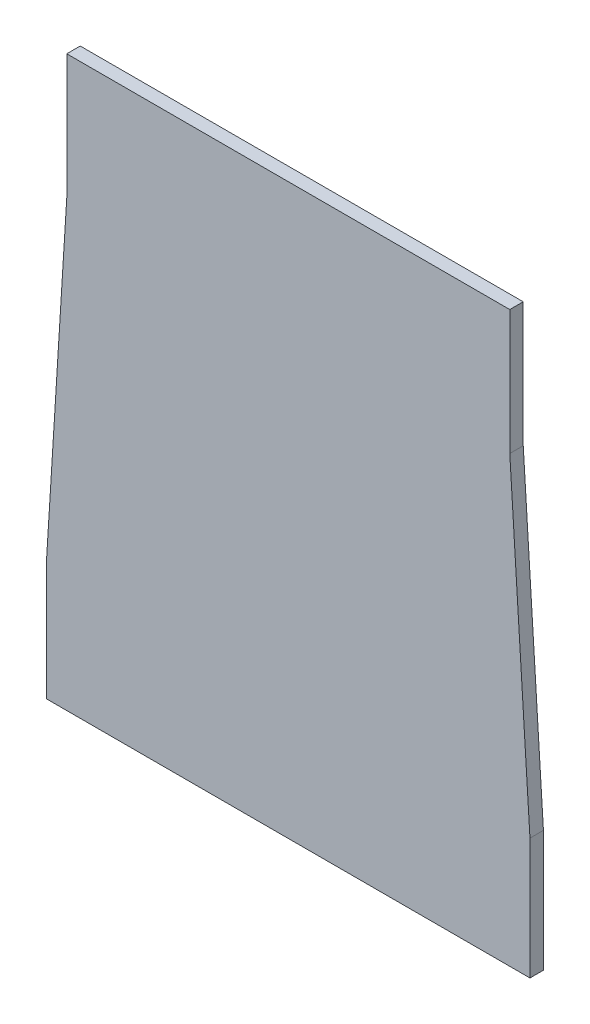
ISO-10303-21;
HEADER;
FILE_DESCRIPTION(('STEP AP214'),'2;1');
FILE_NAME('part.step','',(''),(''),'','','');
FILE_SCHEMA(('AUTOMOTIVE_DESIGN { 1 0 10303 214 1 1 1 1 }'));
ENDSEC;
DATA;
#1=APPLICATION_CONTEXT('core data for automotive mechanical design processes');
#2=APPLICATION_PROTOCOL_DEFINITION('international standard','automotive_design',2000,#1);
#3=PRODUCT_CONTEXT('',#1,'mechanical');
#4=PRODUCT('Part','Part','',(#3));
#5=PRODUCT_RELATED_PRODUCT_CATEGORY('part','',(#4));
#6=PRODUCT_DEFINITION_FORMATION('','',#4);
#7=PRODUCT_DEFINITION_CONTEXT('part definition',#1,'design');
#8=PRODUCT_DEFINITION('design','',#6,#7);
#9=PRODUCT_DEFINITION_SHAPE('','',#8);
#10=(LENGTH_UNIT() NAMED_UNIT(*) SI_UNIT(.MILLI.,.METRE.));
#11=(NAMED_UNIT(*) PLANE_ANGLE_UNIT() SI_UNIT($,.RADIAN.));
#12=(NAMED_UNIT(*) SI_UNIT($,.STERADIAN.) SOLID_ANGLE_UNIT());
#13=UNCERTAINTY_MEASURE_WITH_UNIT(LENGTH_MEASURE(1.E-05),#10,'distance_accuracy_value','');
#14=(GEOMETRIC_REPRESENTATION_CONTEXT(3) GLOBAL_UNCERTAINTY_ASSIGNED_CONTEXT((#13)) GLOBAL_UNIT_ASSIGNED_CONTEXT((#10,
#11,#12)) REPRESENTATION_CONTEXT('',''));
#15=CARTESIAN_POINT('',(0.,0.,0.));
#16=DIRECTION('',(0.,0.,1.));
#17=DIRECTION('',(1.,0.,0.));
#18=AXIS2_PLACEMENT_3D('',#15,#16,#17);
#19=CARTESIAN_POINT('',(209.03946,-5469.17953057513,12.7));
#20=DIRECTION('',(-1.,0.,0.));
#21=DIRECTION('',(0.,0.,1.));
#22=AXIS2_PLACEMENT_3D('',#19,#20,#21);
#23=PLANE('',#22);
#24=DIRECTION('',(0.,1.,0.));
#25=VECTOR('',#24,1.);
#26=CARTESIAN_POINT('',(209.03946,-5469.17953057513,12.7));
#27=LINE('',#26,#25);
#28=CARTESIAN_POINT('',(209.03946,-5158.00577036498,12.7));
#29=VERTEX_POINT('',#28);
#30=CARTESIAN_POINT('',(209.03946,-5040.33140744906,12.7));
#31=VERTEX_POINT('',#30);
#32=EDGE_CURVE('E145',#29,#31,#27,.T.);
#33=ORIENTED_EDGE('',*,*,#32,.F.);
#34=DIRECTION('',(0.,0.,-1.));
#35=VECTOR('',#34,1.);
#36=CARTESIAN_POINT('',(209.03946,-5158.00577036498,12.7));
#37=LINE('',#36,#35);
#38=CARTESIAN_POINT('',(209.03946,-5158.00577036498,0.));
#39=VERTEX_POINT('',#38);
#40=EDGE_CURVE('E151',#29,#39,#37,.T.);
#41=ORIENTED_EDGE('',*,*,#40,.T.);
#42=DIRECTION('',(0.,1.,0.));
#43=VECTOR('',#42,1.);
#44=CARTESIAN_POINT('',(209.03946,-5469.17953057513,0.));
#45=LINE('',#44,#43);
#46=CARTESIAN_POINT('',(209.03946,-5040.33140744906,0.));
#47=VERTEX_POINT('',#46);
#48=EDGE_CURVE('E115',#39,#47,#45,.T.);
#49=ORIENTED_EDGE('',*,*,#48,.T.);
#50=DIRECTION('',(0.,0.,-1.));
#51=VECTOR('',#50,1.);
#52=CARTESIAN_POINT('',(209.03946,-5040.33140744906,12.7));
#53=LINE('',#52,#51);
#54=EDGE_CURVE('E139',#31,#47,#53,.T.);
#55=ORIENTED_EDGE('',*,*,#54,.F.);
#56=EDGE_LOOP('',(#33,#41,#49,#55));
#57=FACE_BOUND('',#56,.T.);
#58=ADVANCED_FACE('F35',(#57),#23,.F.);
#59=CARTESIAN_POINT('',(-209.03946,-5469.17953057513,12.7));
#60=DIRECTION('',(1.,0.,0.));
#61=DIRECTION('',(0.,0.,-1.));
#62=AXIS2_PLACEMENT_3D('',#59,#60,#61);
#63=PLANE('',#62);
#64=DIRECTION('',(0.,-1.,0.));
#65=VECTOR('',#64,1.);
#66=CARTESIAN_POINT('',(-209.03946,-5469.17953057513,0.));
#67=LINE('',#66,#65);
#68=CARTESIAN_POINT('',(-209.03946,-5040.33140744906,0.));
#69=VERTEX_POINT('',#68);
#70=CARTESIAN_POINT('',(-209.03946,-5158.00577036498,0.));
#71=VERTEX_POINT('',#70);
#72=EDGE_CURVE('E148',#69,#71,#67,.T.);
#73=ORIENTED_EDGE('',*,*,#72,.T.);
#74=DIRECTION('',(0.,0.,1.));
#75=VECTOR('',#74,1.);
#76=CARTESIAN_POINT('',(-209.03946,-5158.00577036498,12.7));
#77=LINE('',#76,#75);
#78=CARTESIAN_POINT('',(-209.03946,-5158.00577036498,12.7));
#79=VERTEX_POINT('',#78);
#80=EDGE_CURVE('E157',#71,#79,#77,.T.);
#81=ORIENTED_EDGE('',*,*,#80,.T.);
#82=DIRECTION('',(0.,-1.,0.));
#83=VECTOR('',#82,1.);
#84=CARTESIAN_POINT('',(-209.03946,-5469.17953057513,12.7));
#85=LINE('',#84,#83);
#86=CARTESIAN_POINT('',(-209.03946,-5040.33140744906,12.7));
#87=VERTEX_POINT('',#86);
#88=EDGE_CURVE('E147',#87,#79,#85,.T.);
#89=ORIENTED_EDGE('',*,*,#88,.F.);
#90=DIRECTION('',(0.,0.,-1.));
#91=VECTOR('',#90,1.);
#92=CARTESIAN_POINT('',(-209.03946,-5040.33140744906,12.7));
#93=LINE('',#92,#91);
#94=EDGE_CURVE('E136',#87,#69,#93,.T.);
#95=ORIENTED_EDGE('',*,*,#94,.T.);
#96=EDGE_LOOP('',(#73,#81,#89,#95));
#97=FACE_BOUND('',#96,.T.);
#98=ADVANCED_FACE('F170',(#97),#63,.F.);
#99=CARTESIAN_POINT('',(0.,0.,12.7));
#100=DIRECTION('',(0.,0.,1.));
#101=DIRECTION('',(1.,0.,0.));
#102=AXIS2_PLACEMENT_3D('',#99,#100,#101);
#103=PLANE('',#102);
#104=DIRECTION('',(-1.,0.,0.));
#105=VECTOR('',#104,1.);
#106=CARTESIAN_POINT('',(209.03946,-5577.12953057513,12.7));
#107=LINE('',#106,#105);
#108=CARTESIAN_POINT('',(228.088766336441,-5577.12953057513,12.7));
#109=VERTEX_POINT('',#108);
#110=CARTESIAN_POINT('',(-228.088766336441,-5577.12953057513,12.7));
#111=VERTEX_POINT('',#110);
#112=EDGE_CURVE('E106',#109,#111,#107,.T.);
#113=ORIENTED_EDGE('',*,*,#112,.F.);
#114=DIRECTION('',(0.,-1.,0.));
#115=VECTOR('',#114,1.);
#116=CARTESIAN_POINT('',(228.088766336441,-5462.80577036498,12.7));
#117=LINE('',#116,#115);
#118=CARTESIAN_POINT('',(228.088766336441,-5462.79467174804,12.7));
#119=VERTEX_POINT('',#118);
#120=EDGE_CURVE('E110',#119,#109,#117,.T.);
#121=ORIENTED_EDGE('',*,*,#120,.F.);
#122=DIRECTION('',(-0.0623782861551805,0.998052578482889,0.));
#123=VECTOR('',#122,1.);
#124=CARTESIAN_POINT('',(209.03946,-5158.00577036498,12.7));
#125=LINE('',#124,#123);
#126=EDGE_CURVE('E162',#119,#29,#125,.T.);
#127=ORIENTED_EDGE('',*,*,#126,.T.);
#128=ORIENTED_EDGE('',*,*,#32,.T.);
#129=DIRECTION('',(1.,0.,0.));
#130=VECTOR('',#129,1.);
#131=CARTESIAN_POINT('',(-209.03946,-5040.33140744906,12.7));
#132=LINE('',#131,#130);
#133=EDGE_CURVE('E133',#87,#31,#132,.T.);
#134=ORIENTED_EDGE('',*,*,#133,.F.);
#135=ORIENTED_EDGE('',*,*,#88,.T.);
#136=DIRECTION('',(-0.0623782861551805,-0.998052578482889,0.));
#137=VECTOR('',#136,1.);
#138=CARTESIAN_POINT('',(-209.03946,-5158.00577036498,12.7));
#139=LINE('',#138,#137);
#140=CARTESIAN_POINT('',(-228.088766336441,-5462.79467174804,12.7));
#141=VERTEX_POINT('',#140);
#142=EDGE_CURVE('E72',#79,#141,#139,.T.);
#143=ORIENTED_EDGE('',*,*,#142,.T.);
#144=DIRECTION('',(0.,1.,0.));
#145=VECTOR('',#144,1.);
#146=CARTESIAN_POINT('',(-228.088766336441,-5462.80577036498,12.7));
#147=LINE('',#146,#145);
#148=EDGE_CURVE('E111',#111,#141,#147,.T.);
#149=ORIENTED_EDGE('',*,*,#148,.F.);
#150=EDGE_LOOP('',(#113,#121,#127,#128,#134,#135,#143,#149));
#151=FACE_BOUND('',#150,.T.);
#152=ADVANCED_FACE('F108',(#151),#103,.T.);
#153=CARTESIAN_POINT('',(0.,0.,0.));
#154=DIRECTION('',(0.,0.,1.));
#155=DIRECTION('',(1.,0.,0.));
#156=AXIS2_PLACEMENT_3D('',#153,#154,#155);
#157=PLANE('',#156);
#158=ORIENTED_EDGE('',*,*,#48,.F.);
#159=DIRECTION('',(0.0623782861551805,-0.998052578482889,0.));
#160=VECTOR('',#159,1.);
#161=CARTESIAN_POINT('',(-112.894904925446,-7.0559315578404,0.));
#162=LINE('',#161,#160);
#163=CARTESIAN_POINT('',(228.088766336441,-5462.79467174804,0.));
#164=VERTEX_POINT('',#163);
#165=EDGE_CURVE('E159',#39,#164,#162,.T.);
#166=ORIENTED_EDGE('',*,*,#165,.T.);
#167=DIRECTION('',(0.,-1.,0.));
#168=VECTOR('',#167,1.);
#169=CARTESIAN_POINT('',(228.088766336441,-5462.80577036498,0.));
#170=LINE('',#169,#168);
#171=CARTESIAN_POINT('',(228.088766336441,-5577.12953057513,0.));
#172=VERTEX_POINT('',#171);
#173=EDGE_CURVE('E63',#164,#172,#170,.T.);
#174=ORIENTED_EDGE('',*,*,#173,.T.);
#175=DIRECTION('',(-1.,0.,0.));
#176=VECTOR('',#175,1.);
#177=CARTESIAN_POINT('',(209.03946,-5577.12953057513,0.));
#178=LINE('',#177,#176);
#179=CARTESIAN_POINT('',(-228.088766336441,-5577.12953057513,0.));
#180=VERTEX_POINT('',#179);
#181=EDGE_CURVE('E116',#172,#180,#178,.T.);
#182=ORIENTED_EDGE('',*,*,#181,.T.);
#183=DIRECTION('',(0.,1.,0.));
#184=VECTOR('',#183,1.);
#185=CARTESIAN_POINT('',(-228.088766336441,-5462.80577036498,0.));
#186=LINE('',#185,#184);
#187=CARTESIAN_POINT('',(-228.088766336441,-5462.79467174804,0.));
#188=VERTEX_POINT('',#187);
#189=EDGE_CURVE('E50',#180,#188,#186,.T.);
#190=ORIENTED_EDGE('',*,*,#189,.T.);
#191=DIRECTION('',(0.0623782861551805,0.998052578482889,0.));
#192=VECTOR('',#191,1.);
#193=CARTESIAN_POINT('',(112.894904925446,-7.0559315578404,0.));
#194=LINE('',#193,#192);
#195=EDGE_CURVE('E11',#188,#71,#194,.T.);
#196=ORIENTED_EDGE('',*,*,#195,.T.);
#197=ORIENTED_EDGE('',*,*,#72,.F.);
#198=DIRECTION('',(1.,0.,0.));
#199=VECTOR('',#198,1.);
#200=CARTESIAN_POINT('',(-209.03946,-5040.33140744906,0.));
#201=LINE('',#200,#199);
#202=EDGE_CURVE('E132',#69,#47,#201,.T.);
#203=ORIENTED_EDGE('',*,*,#202,.T.);
#204=EDGE_LOOP('',(#158,#166,#174,#182,#190,#196,#197,#203));
#205=FACE_BOUND('',#204,.T.);
#206=ADVANCED_FACE('F168',(#205),#157,.F.);
#207=CARTESIAN_POINT('',(209.03946,-5577.12953057513,12.7));
#208=DIRECTION('',(0.,-1.,0.));
#209=DIRECTION('',(0.,0.,-1.));
#210=AXIS2_PLACEMENT_3D('',#207,#208,#209);
#211=PLANE('',#210);
#212=ORIENTED_EDGE('',*,*,#181,.F.);
#213=DIRECTION('',(0.,0.,-1.));
#214=VECTOR('',#213,1.);
#215=CARTESIAN_POINT('',(228.088766336441,-5577.12953057513,12.7));
#216=LINE('',#215,#214);
#217=EDGE_CURVE('E118',#109,#172,#216,.T.);
#218=ORIENTED_EDGE('',*,*,#217,.F.);
#219=ORIENTED_EDGE('',*,*,#112,.T.);
#220=DIRECTION('',(0.,0.,-1.));
#221=VECTOR('',#220,1.);
#222=CARTESIAN_POINT('',(-228.088766336441,-5577.12953057513,12.7));
#223=LINE('',#222,#221);
#224=EDGE_CURVE('E129',#111,#180,#223,.T.);
#225=ORIENTED_EDGE('',*,*,#224,.T.);
#226=EDGE_LOOP('',(#212,#218,#219,#225));
#227=FACE_BOUND('',#226,.T.);
#228=ADVANCED_FACE('F119',(#227),#211,.T.);
#229=CARTESIAN_POINT('',(-209.03946,-5040.33140744906,12.7));
#230=DIRECTION('',(0.,1.,0.));
#231=DIRECTION('',(0.,0.,1.));
#232=AXIS2_PLACEMENT_3D('',#229,#230,#231);
#233=PLANE('',#232);
#234=ORIENTED_EDGE('',*,*,#202,.F.);
#235=ORIENTED_EDGE('',*,*,#94,.F.);
#236=ORIENTED_EDGE('',*,*,#133,.T.);
#237=ORIENTED_EDGE('',*,*,#54,.T.);
#238=EDGE_LOOP('',(#234,#235,#236,#237));
#239=FACE_BOUND('',#238,.T.);
#240=ADVANCED_FACE('F175',(#239),#233,.T.);
#241=CARTESIAN_POINT('',(-228.088766336441,-5462.80577036498,12.7));
#242=DIRECTION('',(-1.,0.,0.));
#243=DIRECTION('',(0.,0.,1.));
#244=AXIS2_PLACEMENT_3D('',#241,#242,#243);
#245=PLANE('',#244);
#246=ORIENTED_EDGE('',*,*,#189,.F.);
#247=ORIENTED_EDGE('',*,*,#224,.F.);
#248=ORIENTED_EDGE('',*,*,#148,.T.);
#249=DIRECTION('',(0.,0.,-1.));
#250=VECTOR('',#249,1.);
#251=CARTESIAN_POINT('',(-228.088766336441,-5462.79467174804,12.7));
#252=LINE('',#251,#250);
#253=EDGE_CURVE('E44',#141,#188,#252,.T.);
#254=ORIENTED_EDGE('',*,*,#253,.T.);
#255=EDGE_LOOP('',(#246,#247,#248,#254));
#256=FACE_BOUND('',#255,.T.);
#257=ADVANCED_FACE('F166',(#256),#245,.T.);
#258=CARTESIAN_POINT('',(228.088766336441,-5462.80577036498,12.7));
#259=DIRECTION('',(1.,0.,0.));
#260=DIRECTION('',(0.,0.,-1.));
#261=AXIS2_PLACEMENT_3D('',#258,#259,#260);
#262=PLANE('',#261);
#263=ORIENTED_EDGE('',*,*,#173,.F.);
#264=DIRECTION('',(0.,0.,1.));
#265=VECTOR('',#264,1.);
#266=CARTESIAN_POINT('',(228.088766336441,-5462.79467174804,12.7));
#267=LINE('',#266,#265);
#268=EDGE_CURVE('E123',#164,#119,#267,.T.);
#269=ORIENTED_EDGE('',*,*,#268,.T.);
#270=ORIENTED_EDGE('',*,*,#120,.T.);
#271=ORIENTED_EDGE('',*,*,#217,.T.);
#272=EDGE_LOOP('',(#263,#269,#270,#271));
#273=FACE_BOUND('',#272,.T.);
#274=ADVANCED_FACE('F121',(#273),#262,.T.);
#275=CARTESIAN_POINT('',(209.03946,-5158.00577036498,12.7));
#276=DIRECTION('',(-0.998052578482889,-0.0623782861551805,0.));
#277=DIRECTION('',(0.,0.,-1.));
#278=AXIS2_PLACEMENT_3D('',#275,#276,#277);
#279=PLANE('',#278);
#280=ORIENTED_EDGE('',*,*,#126,.F.);
#281=ORIENTED_EDGE('',*,*,#268,.F.);
#282=ORIENTED_EDGE('',*,*,#165,.F.);
#283=ORIENTED_EDGE('',*,*,#40,.F.);
#284=EDGE_LOOP('',(#280,#281,#282,#283));
#285=FACE_BOUND('',#284,.T.);
#286=ADVANCED_FACE('F181',(#285),#279,.F.);
#287=CARTESIAN_POINT('',(-209.03946,-5158.00577036498,12.7));
#288=DIRECTION('',(0.998052578482889,-0.0623782861551805,0.));
#289=DIRECTION('',(0.,0.,1.));
#290=AXIS2_PLACEMENT_3D('',#287,#288,#289);
#291=PLANE('',#290);
#292=ORIENTED_EDGE('',*,*,#195,.F.);
#293=ORIENTED_EDGE('',*,*,#253,.F.);
#294=ORIENTED_EDGE('',*,*,#142,.F.);
#295=ORIENTED_EDGE('',*,*,#80,.F.);
#296=EDGE_LOOP('',(#292,#293,#294,#295));
#297=FACE_BOUND('',#296,.T.);
#298=ADVANCED_FACE('F37',(#297),#291,.F.);
#299=CLOSED_SHELL('',(#58,#98,#152,#206,#228,#240,#257,#274,#286,#298));
#300=MANIFOLD_SOLID_BREP('B2',#299);
#301=ADVANCED_BREP_SHAPE_REPRESENTATION('',(#18,#300),#14);
#302=SHAPE_DEFINITION_REPRESENTATION(#9,#301);
ENDSEC;
END-ISO-10303-21;
